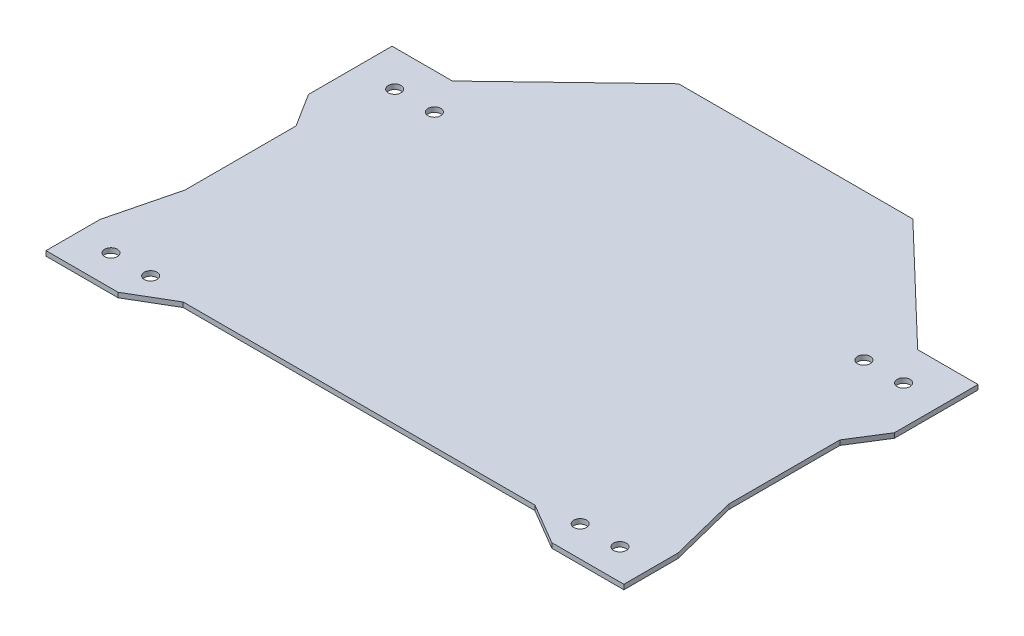
ISO-10303-21;
HEADER;
FILE_DESCRIPTION(('STEP AP214'),'2;1');
FILE_NAME('part.step','',(''),(''),'','','');
FILE_SCHEMA(('AUTOMOTIVE_DESIGN { 1 0 10303 214 1 1 1 1 }'));
ENDSEC;
DATA;
#1=APPLICATION_CONTEXT('core data for automotive mechanical design processes');
#2=APPLICATION_PROTOCOL_DEFINITION('international standard','automotive_design',2000,#1);
#3=PRODUCT_CONTEXT('',#1,'mechanical');
#4=PRODUCT('Part','Part','',(#3));
#5=PRODUCT_RELATED_PRODUCT_CATEGORY('part','',(#4));
#6=PRODUCT_DEFINITION_FORMATION('','',#4);
#7=PRODUCT_DEFINITION_CONTEXT('part definition',#1,'design');
#8=PRODUCT_DEFINITION('design','',#6,#7);
#9=PRODUCT_DEFINITION_SHAPE('','',#8);
#10=(LENGTH_UNIT() NAMED_UNIT(*) SI_UNIT(.MILLI.,.METRE.));
#11=(NAMED_UNIT(*) PLANE_ANGLE_UNIT() SI_UNIT($,.RADIAN.));
#12=(NAMED_UNIT(*) SI_UNIT($,.STERADIAN.) SOLID_ANGLE_UNIT());
#13=UNCERTAINTY_MEASURE_WITH_UNIT(LENGTH_MEASURE(1.E-05),#10,'distance_accuracy_value','');
#14=(GEOMETRIC_REPRESENTATION_CONTEXT(3) GLOBAL_UNCERTAINTY_ASSIGNED_CONTEXT((#13)) GLOBAL_UNIT_ASSIGNED_CONTEXT((#10,
#11,#12)) REPRESENTATION_CONTEXT('',''));
#15=CARTESIAN_POINT('',(0.,0.,0.));
#16=DIRECTION('',(0.,0.,1.));
#17=DIRECTION('',(1.,0.,0.));
#18=AXIS2_PLACEMENT_3D('',#15,#16,#17);
#19=CARTESIAN_POINT('',(0.,1.7,0.));
#20=DIRECTION('',(0.,1.,0.));
#21=DIRECTION('',(0.,0.,1.));
#22=AXIS2_PLACEMENT_3D('',#19,#20,#21);
#23=PLANE('',#22);
#24=CARTESIAN_POINT('',(75.69375,1.7,-132.844175958542));
#25=DIRECTION('',(0.,1.,0.));
#26=DIRECTION('',(0.,0.,-1.));
#27=AXIS2_PLACEMENT_3D('',#24,#25,#26);
#28=CIRCLE('',#27,2.25);
#29=CARTESIAN_POINT('',(75.69375,1.7,-135.094175958542));
#30=VERTEX_POINT('',#29);
#31=EDGE_CURVE('E481',#30,#30,#28,.T.);
#32=ORIENTED_EDGE('',*,*,#31,.F.);
#33=EDGE_LOOP('',(#32));
#34=FACE_BOUND('',#33,.T.);
#35=CARTESIAN_POINT('',(75.69375,1.7,-32.8489759585417));
#36=DIRECTION('',(0.,1.,0.));
#37=DIRECTION('',(0.,0.,-1.));
#38=AXIS2_PLACEMENT_3D('',#35,#36,#37);
#39=CIRCLE('',#38,2.25);
#40=CARTESIAN_POINT('',(75.69375,1.7,-35.0989759585417));
#41=VERTEX_POINT('',#40);
#42=EDGE_CURVE('E497',#41,#41,#39,.T.);
#43=ORIENTED_EDGE('',*,*,#42,.F.);
#44=EDGE_LOOP('',(#43));
#45=FACE_BOUND('',#44,.T.);
#46=CARTESIAN_POINT('',(-89.69375,1.7,-132.844175958542));
#47=DIRECTION('',(0.,1.,0.));
#48=DIRECTION('',(0.,0.,1.));
#49=AXIS2_PLACEMENT_3D('',#46,#47,#48);
#50=CIRCLE('',#49,2.25);
#51=CARTESIAN_POINT('',(-89.69375,1.7,-130.594175958542));
#52=VERTEX_POINT('',#51);
#53=EDGE_CURVE('E513',#52,#52,#50,.T.);
#54=ORIENTED_EDGE('',*,*,#53,.F.);
#55=EDGE_LOOP('',(#54));
#56=FACE_BOUND('',#55,.T.);
#57=CARTESIAN_POINT('',(-89.69375,1.7,-32.8489759585416));
#58=DIRECTION('',(0.,1.,0.));
#59=DIRECTION('',(0.,0.,1.));
#60=AXIS2_PLACEMENT_3D('',#57,#58,#59);
#61=CIRCLE('',#60,2.25);
#62=CARTESIAN_POINT('',(-89.69375,1.7,-30.5989759585416));
#63=VERTEX_POINT('',#62);
#64=EDGE_CURVE('E223',#63,#63,#61,.T.);
#65=ORIENTED_EDGE('',*,*,#64,.F.);
#66=EDGE_LOOP('',(#65));
#67=FACE_BOUND('',#66,.T.);
#68=DIRECTION('',(-0.721982227225083,0.,0.69191160098029));
#69=VECTOR('',#68,1.);
#70=CARTESIAN_POINT('',(-41.275,1.7,-184.522975958542));
#71=LINE('',#70,#69);
#72=CARTESIAN_POINT('',(-41.275,1.7,-184.522975958542));
#73=VERTEX_POINT('',#72);
#74=CARTESIAN_POINT('',(-82.,1.7,-145.494175958542));
#75=VERTEX_POINT('',#74);
#76=EDGE_CURVE('E277',#73,#75,#71,.T.);
#77=ORIENTED_EDGE('',*,*,#76,.T.);
#78=DIRECTION('',(-1.,0.,0.));
#79=VECTOR('',#78,1.);
#80=CARTESIAN_POINT('',(-82.,1.7,-145.494175958542));
#81=LINE('',#80,#79);
#82=CARTESIAN_POINT('',(-103.26875,1.7,-145.494175958542));
#83=VERTEX_POINT('',#82);
#84=EDGE_CURVE('E141',#75,#83,#81,.T.);
#85=ORIENTED_EDGE('',*,*,#84,.T.);
#86=DIRECTION('',(0.,0.,1.));
#87=VECTOR('',#86,1.);
#88=CARTESIAN_POINT('',(-103.26875,1.7,-145.494175958542));
#89=LINE('',#88,#87);
#90=CARTESIAN_POINT('',(-103.26875,1.7,-116.051129388527));
#91=VERTEX_POINT('',#90);
#92=EDGE_CURVE('E346',#83,#91,#89,.T.);
#93=ORIENTED_EDGE('',*,*,#92,.T.);
#94=DIRECTION('',(0.531543936879277,0.,0.847030721501221));
#95=VECTOR('',#94,1.);
#96=CARTESIAN_POINT('',(-103.26875,1.7,-116.051129388527));
#97=LINE('',#96,#95);
#98=CARTESIAN_POINT('',(-95.8437500000001,1.7,-104.219175958542));
#99=VERTEX_POINT('',#98);
#100=EDGE_CURVE('E366',#91,#99,#97,.T.);
#101=ORIENTED_EDGE('',*,*,#100,.T.);
#102=DIRECTION('',(0.,0.,1.));
#103=VECTOR('',#102,1.);
#104=CARTESIAN_POINT('',(-95.8437500000001,1.7,-104.219175958542));
#105=LINE('',#104,#103);
#106=CARTESIAN_POINT('',(-95.8437500000001,1.7,-65.0989759585416));
#107=VERTEX_POINT('',#106);
#108=EDGE_CURVE('E362',#99,#107,#105,.T.);
#109=ORIENTED_EDGE('',*,*,#108,.T.);
#110=DIRECTION('',(-0.24296627076329,0.,0.970034737146758));
#111=VECTOR('',#110,1.);
#112=CARTESIAN_POINT('',(-95.8437500000001,1.7,-65.0989759585416));
#113=LINE('',#112,#111);
#114=CARTESIAN_POINT('',(-101.84375,1.7,-41.1441759585416));
#115=VERTEX_POINT('',#114);
#116=EDGE_CURVE('E365',#107,#115,#113,.T.);
#117=ORIENTED_EDGE('',*,*,#116,.T.);
#118=DIRECTION('',(0.,0.,1.));
#119=VECTOR('',#118,1.);
#120=CARTESIAN_POINT('',(-101.84375,1.7,-41.1441759585416));
#121=LINE('',#120,#119);
#122=CARTESIAN_POINT('',(-101.84375,1.7,-22.0941759585416));
#123=VERTEX_POINT('',#122);
#124=EDGE_CURVE('E370',#115,#123,#121,.T.);
#125=ORIENTED_EDGE('',*,*,#124,.T.);
#126=DIRECTION('',(1.,0.,0.));
#127=VECTOR('',#126,1.);
#128=CARTESIAN_POINT('',(-101.84375,1.7,-22.0941759585416));
#129=LINE('',#128,#127);
#130=CARTESIAN_POINT('',(-76.44375,1.7,-22.0941759585416));
#131=VERTEX_POINT('',#130);
#132=EDGE_CURVE('E377',#123,#131,#129,.T.);
#133=ORIENTED_EDGE('',*,*,#132,.T.);
#134=DIRECTION('',(0.861809081293842,0.,-0.507232794089129));
#135=VECTOR('',#134,1.);
#136=CARTESIAN_POINT('',(-76.44375,1.7,-22.0941759585416));
#137=LINE('',#136,#135);
#138=CARTESIAN_POINT('',(-61.9937500000001,1.7,-30.5989759585416));
#139=VERTEX_POINT('',#138);
#140=EDGE_CURVE('E380',#131,#139,#137,.T.);
#141=ORIENTED_EDGE('',*,*,#140,.T.);
#142=DIRECTION('',(1.,0.,0.));
#143=VECTOR('',#142,1.);
#144=CARTESIAN_POINT('',(-61.9937500000001,1.7,-30.5989759585416));
#145=LINE('',#144,#143);
#146=CARTESIAN_POINT('',(61.9937500000001,1.7,-30.5989759585416));
#147=VERTEX_POINT('',#146);
#148=EDGE_CURVE('E383',#139,#147,#145,.T.);
#149=ORIENTED_EDGE('',*,*,#148,.T.);
#150=DIRECTION('',(0.861809081293842,0.,0.507232794089129));
#151=VECTOR('',#150,1.);
#152=CARTESIAN_POINT('',(76.44375,1.7,-22.0941759585416));
#153=LINE('',#152,#151);
#154=CARTESIAN_POINT('',(76.44375,1.7,-22.0941759585416));
#155=VERTEX_POINT('',#154);
#156=EDGE_CURVE('E386',#147,#155,#153,.T.);
#157=ORIENTED_EDGE('',*,*,#156,.T.);
#158=DIRECTION('',(1.,0.,0.));
#159=VECTOR('',#158,1.);
#160=CARTESIAN_POINT('',(101.84375,1.7,-22.0941759585416));
#161=LINE('',#160,#159);
#162=CARTESIAN_POINT('',(101.84375,1.7,-22.0941759585416));
#163=VERTEX_POINT('',#162);
#164=EDGE_CURVE('E389',#155,#163,#161,.T.);
#165=ORIENTED_EDGE('',*,*,#164,.T.);
#166=DIRECTION('',(0.,0.,-1.));
#167=VECTOR('',#166,1.);
#168=CARTESIAN_POINT('',(101.84375,1.7,-41.1441759585417));
#169=LINE('',#168,#167);
#170=CARTESIAN_POINT('',(101.84375,1.7,-41.1441759585417));
#171=VERTEX_POINT('',#170);
#172=EDGE_CURVE('E392',#163,#171,#169,.T.);
#173=ORIENTED_EDGE('',*,*,#172,.T.);
#174=DIRECTION('',(-0.24296627076329,0.,-0.970034737146758));
#175=VECTOR('',#174,1.);
#176=CARTESIAN_POINT('',(95.8437500000001,1.7,-65.0989759585417));
#177=LINE('',#176,#175);
#178=CARTESIAN_POINT('',(95.8437500000001,1.7,-65.0989759585417));
#179=VERTEX_POINT('',#178);
#180=EDGE_CURVE('E395',#171,#179,#177,.T.);
#181=ORIENTED_EDGE('',*,*,#180,.T.);
#182=DIRECTION('',(0.,0.,-1.));
#183=VECTOR('',#182,1.);
#184=CARTESIAN_POINT('',(95.8437500000001,1.7,-104.219175958542));
#185=LINE('',#184,#183);
#186=CARTESIAN_POINT('',(95.8437500000001,1.7,-104.219175958542));
#187=VERTEX_POINT('',#186);
#188=EDGE_CURVE('E398',#179,#187,#185,.T.);
#189=ORIENTED_EDGE('',*,*,#188,.T.);
#190=DIRECTION('',(0.531543936879277,0.,-0.847030721501221));
#191=VECTOR('',#190,1.);
#192=CARTESIAN_POINT('',(103.26875,1.7,-116.051129388527));
#193=LINE('',#192,#191);
#194=CARTESIAN_POINT('',(103.26875,1.7,-116.051129388527));
#195=VERTEX_POINT('',#194);
#196=EDGE_CURVE('E401',#187,#195,#193,.T.);
#197=ORIENTED_EDGE('',*,*,#196,.T.);
#198=DIRECTION('',(0.,0.,-1.));
#199=VECTOR('',#198,1.);
#200=CARTESIAN_POINT('',(103.26875,1.7,-145.494175958542));
#201=LINE('',#200,#199);
#202=CARTESIAN_POINT('',(103.26875,1.7,-145.494175958542));
#203=VERTEX_POINT('',#202);
#204=EDGE_CURVE('E196',#195,#203,#201,.T.);
#205=ORIENTED_EDGE('',*,*,#204,.T.);
#206=DIRECTION('',(-1.,0.,0.));
#207=VECTOR('',#206,1.);
#208=CARTESIAN_POINT('',(82.,1.7,-145.494175958542));
#209=LINE('',#208,#207);
#210=CARTESIAN_POINT('',(82.,1.7,-145.494175958542));
#211=VERTEX_POINT('',#210);
#212=EDGE_CURVE('E190',#203,#211,#209,.T.);
#213=ORIENTED_EDGE('',*,*,#212,.T.);
#214=DIRECTION('',(-0.721982227225084,0.,-0.69191160098029));
#215=VECTOR('',#214,1.);
#216=CARTESIAN_POINT('',(41.275,1.7,-184.522975958542));
#217=LINE('',#216,#215);
#218=CARTESIAN_POINT('',(41.275,1.7,-184.522975958542));
#219=VERTEX_POINT('',#218);
#220=EDGE_CURVE('E194',#211,#219,#217,.T.);
#221=ORIENTED_EDGE('',*,*,#220,.T.);
#222=DIRECTION('',(-1.,0.,0.));
#223=VECTOR('',#222,1.);
#224=CARTESIAN_POINT('',(41.275,1.7,-184.522975958542));
#225=LINE('',#224,#223);
#226=EDGE_CURVE('E62',#219,#73,#225,.T.);
#227=ORIENTED_EDGE('',*,*,#226,.T.);
#228=EDGE_LOOP('',(#77,#85,#93,#101,#109,#117,#125,#133,#141,#149,#157,#165,#173,#181,#189,#197,
#205,#213,#221,#227));
#229=FACE_BOUND('',#228,.T.);
#230=CARTESIAN_POINT('',(-75.69375,1.7,-32.8489759585416));
#231=DIRECTION('',(0.,1.,0.));
#232=DIRECTION('',(0.,0.,1.));
#233=AXIS2_PLACEMENT_3D('',#230,#231,#232);
#234=CIRCLE('',#233,2.25);
#235=CARTESIAN_POINT('',(-75.69375,1.7,-30.5989759585416));
#236=VERTEX_POINT('',#235);
#237=EDGE_CURVE('E521',#236,#236,#234,.T.);
#238=ORIENTED_EDGE('',*,*,#237,.F.);
#239=EDGE_LOOP('',(#238));
#240=FACE_BOUND('',#239,.T.);
#241=CARTESIAN_POINT('',(-75.69375,1.7,-132.844175958542));
#242=DIRECTION('',(0.,1.,0.));
#243=DIRECTION('',(0.,0.,1.));
#244=AXIS2_PLACEMENT_3D('',#241,#242,#243);
#245=CIRCLE('',#244,2.25);
#246=CARTESIAN_POINT('',(-75.69375,1.7,-130.594175958542));
#247=VERTEX_POINT('',#246);
#248=EDGE_CURVE('E505',#247,#247,#245,.T.);
#249=ORIENTED_EDGE('',*,*,#248,.F.);
#250=EDGE_LOOP('',(#249));
#251=FACE_BOUND('',#250,.T.);
#252=CARTESIAN_POINT('',(89.69375,1.7,-32.8489759585416));
#253=DIRECTION('',(0.,1.,0.));
#254=DIRECTION('',(0.,0.,-1.));
#255=AXIS2_PLACEMENT_3D('',#252,#253,#254);
#256=CIRCLE('',#255,2.25);
#257=CARTESIAN_POINT('',(89.69375,1.7,-35.0989759585416));
#258=VERTEX_POINT('',#257);
#259=EDGE_CURVE('E489',#258,#258,#256,.T.);
#260=ORIENTED_EDGE('',*,*,#259,.F.);
#261=EDGE_LOOP('',(#260));
#262=FACE_BOUND('',#261,.T.);
#263=CARTESIAN_POINT('',(89.69375,1.7,-132.844175958542));
#264=DIRECTION('',(0.,1.,0.));
#265=DIRECTION('',(0.,0.,-1.));
#266=AXIS2_PLACEMENT_3D('',#263,#264,#265);
#267=CIRCLE('',#266,2.25);
#268=CARTESIAN_POINT('',(89.69375,1.7,-135.094175958542));
#269=VERTEX_POINT('',#268);
#270=EDGE_CURVE('E470',#269,#269,#267,.T.);
#271=ORIENTED_EDGE('',*,*,#270,.F.);
#272=EDGE_LOOP('',(#271));
#273=FACE_BOUND('',#272,.T.);
#274=ADVANCED_FACE('F44',(#34,#45,#56,#67,#229,#240,#251,#262,#273),#23,.T.);
#275=CARTESIAN_POINT('',(0.,0.,0.));
#276=DIRECTION('',(0.,1.,0.));
#277=DIRECTION('',(0.,0.,1.));
#278=AXIS2_PLACEMENT_3D('',#275,#276,#277);
#279=PLANE('',#278);
#280=DIRECTION('',(-0.721982227225083,0.,0.69191160098029));
#281=VECTOR('',#280,1.);
#282=CARTESIAN_POINT('',(-41.275,0.,-184.522975958542));
#283=LINE('',#282,#281);
#284=CARTESIAN_POINT('',(-41.275,0.,-184.522975958542));
#285=VERTEX_POINT('',#284);
#286=CARTESIAN_POINT('',(-82.,0.,-145.494175958542));
#287=VERTEX_POINT('',#286);
#288=EDGE_CURVE('E218',#285,#287,#283,.T.);
#289=ORIENTED_EDGE('',*,*,#288,.F.);
#290=DIRECTION('',(-1.,0.,0.));
#291=VECTOR('',#290,1.);
#292=CARTESIAN_POINT('',(41.275,0.,-184.522975958542));
#293=LINE('',#292,#291);
#294=CARTESIAN_POINT('',(41.275,0.,-184.522975958542));
#295=VERTEX_POINT('',#294);
#296=EDGE_CURVE('E133',#295,#285,#293,.T.);
#297=ORIENTED_EDGE('',*,*,#296,.F.);
#298=DIRECTION('',(-0.721982227225084,0.,-0.69191160098029));
#299=VECTOR('',#298,1.);
#300=CARTESIAN_POINT('',(41.275,0.,-184.522975958542));
#301=LINE('',#300,#299);
#302=CARTESIAN_POINT('',(82.,0.,-145.494175958542));
#303=VERTEX_POINT('',#302);
#304=EDGE_CURVE('E127',#303,#295,#301,.T.);
#305=ORIENTED_EDGE('',*,*,#304,.F.);
#306=DIRECTION('',(-1.,0.,0.));
#307=VECTOR('',#306,1.);
#308=CARTESIAN_POINT('',(82.,0.,-145.494175958542));
#309=LINE('',#308,#307);
#310=CARTESIAN_POINT('',(103.26875,0.,-145.494175958542));
#311=VERTEX_POINT('',#310);
#312=EDGE_CURVE('E205',#311,#303,#309,.T.);
#313=ORIENTED_EDGE('',*,*,#312,.F.);
#314=DIRECTION('',(0.,0.,-1.));
#315=VECTOR('',#314,1.);
#316=CARTESIAN_POINT('',(103.26875,0.,-145.494175958542));
#317=LINE('',#316,#315);
#318=CARTESIAN_POINT('',(103.26875,0.,-116.051129388527));
#319=VERTEX_POINT('',#318);
#320=EDGE_CURVE('E268',#319,#311,#317,.T.);
#321=ORIENTED_EDGE('',*,*,#320,.F.);
#322=DIRECTION('',(0.531543936879277,0.,-0.847030721501221));
#323=VECTOR('',#322,1.);
#324=CARTESIAN_POINT('',(103.26875,0.,-116.051129388527));
#325=LINE('',#324,#323);
#326=CARTESIAN_POINT('',(95.8437500000001,0.,-104.219175958542));
#327=VERTEX_POINT('',#326);
#328=EDGE_CURVE('E265',#327,#319,#325,.T.);
#329=ORIENTED_EDGE('',*,*,#328,.F.);
#330=DIRECTION('',(0.,0.,-1.));
#331=VECTOR('',#330,1.);
#332=CARTESIAN_POINT('',(95.8437500000001,0.,-104.219175958542));
#333=LINE('',#332,#331);
#334=CARTESIAN_POINT('',(95.8437500000001,0.,-65.0989759585417));
#335=VERTEX_POINT('',#334);
#336=EDGE_CURVE('E262',#335,#327,#333,.T.);
#337=ORIENTED_EDGE('',*,*,#336,.F.);
#338=DIRECTION('',(-0.24296627076329,0.,-0.970034737146758));
#339=VECTOR('',#338,1.);
#340=CARTESIAN_POINT('',(95.8437500000001,0.,-65.0989759585417));
#341=LINE('',#340,#339);
#342=CARTESIAN_POINT('',(101.84375,0.,-41.1441759585417));
#343=VERTEX_POINT('',#342);
#344=EDGE_CURVE('E259',#343,#335,#341,.T.);
#345=ORIENTED_EDGE('',*,*,#344,.F.);
#346=DIRECTION('',(0.,0.,-1.));
#347=VECTOR('',#346,1.);
#348=CARTESIAN_POINT('',(101.84375,0.,-41.1441759585417));
#349=LINE('',#348,#347);
#350=CARTESIAN_POINT('',(101.84375,0.,-22.0941759585416));
#351=VERTEX_POINT('',#350);
#352=EDGE_CURVE('E256',#351,#343,#349,.T.);
#353=ORIENTED_EDGE('',*,*,#352,.F.);
#354=DIRECTION('',(1.,0.,0.));
#355=VECTOR('',#354,1.);
#356=CARTESIAN_POINT('',(101.84375,0.,-22.0941759585416));
#357=LINE('',#356,#355);
#358=CARTESIAN_POINT('',(76.44375,0.,-22.0941759585416));
#359=VERTEX_POINT('',#358);
#360=EDGE_CURVE('E253',#359,#351,#357,.T.);
#361=ORIENTED_EDGE('',*,*,#360,.F.);
#362=DIRECTION('',(0.861809081293842,0.,0.507232794089129));
#363=VECTOR('',#362,1.);
#364=CARTESIAN_POINT('',(76.44375,0.,-22.0941759585416));
#365=LINE('',#364,#363);
#366=CARTESIAN_POINT('',(61.9937500000001,0.,-30.5989759585416));
#367=VERTEX_POINT('',#366);
#368=EDGE_CURVE('E250',#367,#359,#365,.T.);
#369=ORIENTED_EDGE('',*,*,#368,.F.);
#370=DIRECTION('',(1.,0.,0.));
#371=VECTOR('',#370,1.);
#372=CARTESIAN_POINT('',(-61.9937500000001,0.,-30.5989759585416));
#373=LINE('',#372,#371);
#374=CARTESIAN_POINT('',(-61.9937500000001,0.,-30.5989759585416));
#375=VERTEX_POINT('',#374);
#376=EDGE_CURVE('E247',#375,#367,#373,.T.);
#377=ORIENTED_EDGE('',*,*,#376,.F.);
#378=DIRECTION('',(0.861809081293842,0.,-0.507232794089129));
#379=VECTOR('',#378,1.);
#380=CARTESIAN_POINT('',(-76.44375,0.,-22.0941759585416));
#381=LINE('',#380,#379);
#382=CARTESIAN_POINT('',(-76.44375,0.,-22.0941759585416));
#383=VERTEX_POINT('',#382);
#384=EDGE_CURVE('E244',#383,#375,#381,.T.);
#385=ORIENTED_EDGE('',*,*,#384,.F.);
#386=DIRECTION('',(1.,0.,0.));
#387=VECTOR('',#386,1.);
#388=CARTESIAN_POINT('',(-101.84375,0.,-22.0941759585416));
#389=LINE('',#388,#387);
#390=CARTESIAN_POINT('',(-101.84375,0.,-22.0941759585416));
#391=VERTEX_POINT('',#390);
#392=EDGE_CURVE('E241',#391,#383,#389,.T.);
#393=ORIENTED_EDGE('',*,*,#392,.F.);
#394=DIRECTION('',(0.,0.,1.));
#395=VECTOR('',#394,1.);
#396=CARTESIAN_POINT('',(-101.84375,0.,-41.1441759585416));
#397=LINE('',#396,#395);
#398=CARTESIAN_POINT('',(-101.84375,0.,-41.1441759585416));
#399=VERTEX_POINT('',#398);
#400=EDGE_CURVE('E238',#399,#391,#397,.T.);
#401=ORIENTED_EDGE('',*,*,#400,.F.);
#402=DIRECTION('',(-0.24296627076329,0.,0.970034737146758));
#403=VECTOR('',#402,1.);
#404=CARTESIAN_POINT('',(-95.8437500000001,0.,-65.0989759585416));
#405=LINE('',#404,#403);
#406=CARTESIAN_POINT('',(-95.8437500000001,0.,-65.0989759585416));
#407=VERTEX_POINT('',#406);
#408=EDGE_CURVE('E235',#407,#399,#405,.T.);
#409=ORIENTED_EDGE('',*,*,#408,.F.);
#410=DIRECTION('',(0.,0.,1.));
#411=VECTOR('',#410,1.);
#412=CARTESIAN_POINT('',(-95.8437500000001,0.,-104.219175958542));
#413=LINE('',#412,#411);
#414=CARTESIAN_POINT('',(-95.8437500000001,0.,-104.219175958542));
#415=VERTEX_POINT('',#414);
#416=EDGE_CURVE('E232',#415,#407,#413,.T.);
#417=ORIENTED_EDGE('',*,*,#416,.F.);
#418=DIRECTION('',(0.531543936879277,0.,0.847030721501221));
#419=VECTOR('',#418,1.);
#420=CARTESIAN_POINT('',(-103.26875,0.,-116.051129388527));
#421=LINE('',#420,#419);
#422=CARTESIAN_POINT('',(-103.26875,0.,-116.051129388527));
#423=VERTEX_POINT('',#422);
#424=EDGE_CURVE('E229',#423,#415,#421,.T.);
#425=ORIENTED_EDGE('',*,*,#424,.F.);
#426=DIRECTION('',(0.,0.,1.));
#427=VECTOR('',#426,1.);
#428=CARTESIAN_POINT('',(-103.26875,0.,-145.494175958542));
#429=LINE('',#428,#427);
#430=CARTESIAN_POINT('',(-103.26875,0.,-145.494175958542));
#431=VERTEX_POINT('',#430);
#432=EDGE_CURVE('E226',#431,#423,#429,.T.);
#433=ORIENTED_EDGE('',*,*,#432,.F.);
#434=DIRECTION('',(-1.,0.,0.));
#435=VECTOR('',#434,1.);
#436=CARTESIAN_POINT('',(-82.,0.,-145.494175958542));
#437=LINE('',#436,#435);
#438=EDGE_CURVE('E222',#287,#431,#437,.T.);
#439=ORIENTED_EDGE('',*,*,#438,.F.);
#440=EDGE_LOOP('',(#289,#297,#305,#313,#321,#329,#337,#345,#353,#361,#369,#377,#385,#393,#401,
#409,#417,#425,#433,#439));
#441=FACE_BOUND('',#440,.T.);
#442=CARTESIAN_POINT('',(-89.69375,0.,-32.8489759585416));
#443=DIRECTION('',(0.,1.,0.));
#444=DIRECTION('',(0.,0.,1.));
#445=AXIS2_PLACEMENT_3D('',#442,#443,#444);
#446=CIRCLE('',#445,2.25);
#447=CARTESIAN_POINT('',(-89.69375,0.,-30.5989759585416));
#448=VERTEX_POINT('',#447);
#449=EDGE_CURVE('E525',#448,#448,#446,.T.);
#450=ORIENTED_EDGE('',*,*,#449,.T.);
#451=EDGE_LOOP('',(#450));
#452=FACE_BOUND('',#451,.T.);
#453=CARTESIAN_POINT('',(-75.69375,0.,-32.8489759585416));
#454=DIRECTION('',(0.,1.,0.));
#455=DIRECTION('',(0.,0.,1.));
#456=AXIS2_PLACEMENT_3D('',#453,#454,#455);
#457=CIRCLE('',#456,2.25);
#458=CARTESIAN_POINT('',(-75.69375,0.,-30.5989759585416));
#459=VERTEX_POINT('',#458);
#460=EDGE_CURVE('E517',#459,#459,#457,.T.);
#461=ORIENTED_EDGE('',*,*,#460,.T.);
#462=EDGE_LOOP('',(#461));
#463=FACE_BOUND('',#462,.T.);
#464=CARTESIAN_POINT('',(-89.69375,0.,-132.844175958542));
#465=DIRECTION('',(0.,1.,0.));
#466=DIRECTION('',(0.,0.,1.));
#467=AXIS2_PLACEMENT_3D('',#464,#465,#466);
#468=CIRCLE('',#467,2.25);
#469=CARTESIAN_POINT('',(-89.69375,0.,-130.594175958542));
#470=VERTEX_POINT('',#469);
#471=EDGE_CURVE('E509',#470,#470,#468,.T.);
#472=ORIENTED_EDGE('',*,*,#471,.T.);
#473=EDGE_LOOP('',(#472));
#474=FACE_BOUND('',#473,.T.);
#475=CARTESIAN_POINT('',(-75.69375,0.,-132.844175958542));
#476=DIRECTION('',(0.,1.,0.));
#477=DIRECTION('',(0.,0.,1.));
#478=AXIS2_PLACEMENT_3D('',#475,#476,#477);
#479=CIRCLE('',#478,2.25);
#480=CARTESIAN_POINT('',(-75.69375,0.,-130.594175958542));
#481=VERTEX_POINT('',#480);
#482=EDGE_CURVE('E501',#481,#481,#479,.T.);
#483=ORIENTED_EDGE('',*,*,#482,.T.);
#484=EDGE_LOOP('',(#483));
#485=FACE_BOUND('',#484,.T.);
#486=CARTESIAN_POINT('',(75.69375,0.,-32.8489759585417));
#487=DIRECTION('',(0.,1.,0.));
#488=DIRECTION('',(0.,0.,-1.));
#489=AXIS2_PLACEMENT_3D('',#486,#487,#488);
#490=CIRCLE('',#489,2.25);
#491=CARTESIAN_POINT('',(75.69375,0.,-35.0989759585417));
#492=VERTEX_POINT('',#491);
#493=EDGE_CURVE('E493',#492,#492,#490,.T.);
#494=ORIENTED_EDGE('',*,*,#493,.T.);
#495=EDGE_LOOP('',(#494));
#496=FACE_BOUND('',#495,.T.);
#497=CARTESIAN_POINT('',(89.69375,0.,-32.8489759585416));
#498=DIRECTION('',(0.,1.,0.));
#499=DIRECTION('',(0.,0.,-1.));
#500=AXIS2_PLACEMENT_3D('',#497,#498,#499);
#501=CIRCLE('',#500,2.25);
#502=CARTESIAN_POINT('',(89.69375,0.,-35.0989759585416));
#503=VERTEX_POINT('',#502);
#504=EDGE_CURVE('E485',#503,#503,#501,.T.);
#505=ORIENTED_EDGE('',*,*,#504,.T.);
#506=EDGE_LOOP('',(#505));
#507=FACE_BOUND('',#506,.T.);
#508=CARTESIAN_POINT('',(75.69375,0.,-132.844175958542));
#509=DIRECTION('',(0.,1.,0.));
#510=DIRECTION('',(0.,0.,-1.));
#511=AXIS2_PLACEMENT_3D('',#508,#509,#510);
#512=CIRCLE('',#511,2.25);
#513=CARTESIAN_POINT('',(75.69375,0.,-135.094175958542));
#514=VERTEX_POINT('',#513);
#515=EDGE_CURVE('E478',#514,#514,#512,.T.);
#516=ORIENTED_EDGE('',*,*,#515,.T.);
#517=EDGE_LOOP('',(#516));
#518=FACE_BOUND('',#517,.T.);
#519=CARTESIAN_POINT('',(89.69375,0.,-132.844175958542));
#520=DIRECTION('',(0.,1.,0.));
#521=DIRECTION('',(0.,0.,-1.));
#522=AXIS2_PLACEMENT_3D('',#519,#520,#521);
#523=CIRCLE('',#522,2.25);
#524=CARTESIAN_POINT('',(89.69375,0.,-135.094175958542));
#525=VERTEX_POINT('',#524);
#526=EDGE_CURVE('E473',#525,#525,#523,.T.);
#527=ORIENTED_EDGE('',*,*,#526,.T.);
#528=EDGE_LOOP('',(#527));
#529=FACE_BOUND('',#528,.T.);
#530=ADVANCED_FACE('F350',(#441,#452,#463,#474,#485,#496,#507,#518,#529),#279,.F.);
#531=CARTESIAN_POINT('',(-41.275,1.7,-184.522975958542));
#532=DIRECTION('',(0.69191160098029,0.,0.721982227225083));
#533=DIRECTION('',(0.721982227225083,0.,-0.69191160098029));
#534=AXIS2_PLACEMENT_3D('',#531,#532,#533);
#535=PLANE('',#534);
#536=ORIENTED_EDGE('',*,*,#288,.T.);
#537=DIRECTION('',(0.,-1.,0.));
#538=VECTOR('',#537,1.);
#539=CARTESIAN_POINT('',(-82.,1.7,-145.494175958542));
#540=LINE('',#539,#538);
#541=EDGE_CURVE('E11',#75,#287,#540,.T.);
#542=ORIENTED_EDGE('',*,*,#541,.F.);
#543=ORIENTED_EDGE('',*,*,#76,.F.);
#544=DIRECTION('',(0.,-1.,0.));
#545=VECTOR('',#544,1.);
#546=CARTESIAN_POINT('',(-41.275,1.7,-184.522975958542));
#547=LINE('',#546,#545);
#548=EDGE_CURVE('E214',#73,#285,#547,.T.);
#549=ORIENTED_EDGE('',*,*,#548,.T.);
#550=EDGE_LOOP('',(#536,#542,#543,#549));
#551=FACE_BOUND('',#550,.T.);
#552=ADVANCED_FACE('F46',(#551),#535,.F.);
#553=CARTESIAN_POINT('',(-82.,1.7,-145.494175958542));
#554=DIRECTION('',(0.,0.,1.));
#555=DIRECTION('',(1.,0.,0.));
#556=AXIS2_PLACEMENT_3D('',#553,#554,#555);
#557=PLANE('',#556);
#558=ORIENTED_EDGE('',*,*,#438,.T.);
#559=DIRECTION('',(0.,-1.,0.));
#560=VECTOR('',#559,1.);
#561=CARTESIAN_POINT('',(-103.26875,1.7,-145.494175958542));
#562=LINE('',#561,#560);
#563=EDGE_CURVE('E54',#83,#431,#562,.T.);
#564=ORIENTED_EDGE('',*,*,#563,.F.);
#565=ORIENTED_EDGE('',*,*,#84,.F.);
#566=ORIENTED_EDGE('',*,*,#541,.T.);
#567=EDGE_LOOP('',(#558,#564,#565,#566));
#568=FACE_BOUND('',#567,.T.);
#569=ADVANCED_FACE('F765',(#568),#557,.F.);
#570=CARTESIAN_POINT('',(-103.26875,1.7,-145.494175958542));
#571=DIRECTION('',(1.,0.,0.));
#572=DIRECTION('',(0.,0.,-1.));
#573=AXIS2_PLACEMENT_3D('',#570,#571,#572);
#574=PLANE('',#573);
#575=ORIENTED_EDGE('',*,*,#432,.T.);
#576=DIRECTION('',(0.,-1.,0.));
#577=VECTOR('',#576,1.);
#578=CARTESIAN_POINT('',(-103.26875,1.7,-116.051129388527));
#579=LINE('',#578,#577);
#580=EDGE_CURVE('E336',#91,#423,#579,.T.);
#581=ORIENTED_EDGE('',*,*,#580,.F.);
#582=ORIENTED_EDGE('',*,*,#92,.F.);
#583=ORIENTED_EDGE('',*,*,#563,.T.);
#584=EDGE_LOOP('',(#575,#581,#582,#583));
#585=FACE_BOUND('',#584,.T.);
#586=ADVANCED_FACE('F344',(#585),#574,.F.);
#587=CARTESIAN_POINT('',(-103.26875,1.7,-116.051129388527));
#588=DIRECTION('',(0.847030721501221,0.,-0.531543936879277));
#589=DIRECTION('',(-0.531543936879277,0.,-0.847030721501221));
#590=AXIS2_PLACEMENT_3D('',#587,#588,#589);
#591=PLANE('',#590);
#592=ORIENTED_EDGE('',*,*,#424,.T.);
#593=DIRECTION('',(0.,-1.,0.));
#594=VECTOR('',#593,1.);
#595=CARTESIAN_POINT('',(-95.8437500000001,1.7,-104.219175958542));
#596=LINE('',#595,#594);
#597=EDGE_CURVE('E332',#99,#415,#596,.T.);
#598=ORIENTED_EDGE('',*,*,#597,.F.);
#599=ORIENTED_EDGE('',*,*,#100,.F.);
#600=ORIENTED_EDGE('',*,*,#580,.T.);
#601=EDGE_LOOP('',(#592,#598,#599,#600));
#602=FACE_BOUND('',#601,.T.);
#603=ADVANCED_FACE('F356',(#602),#591,.F.);
#604=CARTESIAN_POINT('',(-95.8437500000001,1.7,-104.219175958542));
#605=DIRECTION('',(1.,0.,0.));
#606=DIRECTION('',(0.,0.,-1.));
#607=AXIS2_PLACEMENT_3D('',#604,#605,#606);
#608=PLANE('',#607);
#609=ORIENTED_EDGE('',*,*,#416,.T.);
#610=DIRECTION('',(0.,-1.,0.));
#611=VECTOR('',#610,1.);
#612=CARTESIAN_POINT('',(-95.8437500000001,1.7,-65.0989759585416));
#613=LINE('',#612,#611);
#614=EDGE_CURVE('E328',#107,#407,#613,.T.);
#615=ORIENTED_EDGE('',*,*,#614,.F.);
#616=ORIENTED_EDGE('',*,*,#108,.F.);
#617=ORIENTED_EDGE('',*,*,#597,.T.);
#618=EDGE_LOOP('',(#609,#615,#616,#617));
#619=FACE_BOUND('',#618,.T.);
#620=ADVANCED_FACE('F360',(#619),#608,.F.);
#621=CARTESIAN_POINT('',(-95.8437500000001,1.7,-65.0989759585416));
#622=DIRECTION('',(0.970034737146758,0.,0.24296627076329));
#623=DIRECTION('',(0.24296627076329,0.,-0.970034737146758));
#624=AXIS2_PLACEMENT_3D('',#621,#622,#623);
#625=PLANE('',#624);
#626=ORIENTED_EDGE('',*,*,#408,.T.);
#627=DIRECTION('',(0.,-1.,0.));
#628=VECTOR('',#627,1.);
#629=CARTESIAN_POINT('',(-101.84375,1.7,-41.1441759585416));
#630=LINE('',#629,#628);
#631=EDGE_CURVE('E324',#115,#399,#630,.T.);
#632=ORIENTED_EDGE('',*,*,#631,.F.);
#633=ORIENTED_EDGE('',*,*,#116,.F.);
#634=ORIENTED_EDGE('',*,*,#614,.T.);
#635=EDGE_LOOP('',(#626,#632,#633,#634));
#636=FACE_BOUND('',#635,.T.);
#637=ADVANCED_FACE('F730',(#636),#625,.F.);
#638=CARTESIAN_POINT('',(-101.84375,1.7,-41.1441759585416));
#639=DIRECTION('',(1.,0.,0.));
#640=DIRECTION('',(0.,0.,-1.));
#641=AXIS2_PLACEMENT_3D('',#638,#639,#640);
#642=PLANE('',#641);
#643=ORIENTED_EDGE('',*,*,#400,.T.);
#644=DIRECTION('',(0.,-1.,0.));
#645=VECTOR('',#644,1.);
#646=CARTESIAN_POINT('',(-101.84375,1.7,-22.0941759585416));
#647=LINE('',#646,#645);
#648=EDGE_CURVE('E320',#123,#391,#647,.T.);
#649=ORIENTED_EDGE('',*,*,#648,.F.);
#650=ORIENTED_EDGE('',*,*,#124,.F.);
#651=ORIENTED_EDGE('',*,*,#631,.T.);
#652=EDGE_LOOP('',(#643,#649,#650,#651));
#653=FACE_BOUND('',#652,.T.);
#654=ADVANCED_FACE('F720',(#653),#642,.F.);
#655=CARTESIAN_POINT('',(-101.84375,1.7,-22.0941759585416));
#656=DIRECTION('',(0.,0.,-1.));
#657=DIRECTION('',(-1.,0.,0.));
#658=AXIS2_PLACEMENT_3D('',#655,#656,#657);
#659=PLANE('',#658);
#660=ORIENTED_EDGE('',*,*,#392,.T.);
#661=DIRECTION('',(0.,-1.,0.));
#662=VECTOR('',#661,1.);
#663=CARTESIAN_POINT('',(-76.44375,1.7,-22.0941759585416));
#664=LINE('',#663,#662);
#665=EDGE_CURVE('E316',#131,#383,#664,.T.);
#666=ORIENTED_EDGE('',*,*,#665,.F.);
#667=ORIENTED_EDGE('',*,*,#132,.F.);
#668=ORIENTED_EDGE('',*,*,#648,.T.);
#669=EDGE_LOOP('',(#660,#666,#667,#668));
#670=FACE_BOUND('',#669,.T.);
#671=ADVANCED_FACE('F710',(#670),#659,.F.);
#672=CARTESIAN_POINT('',(-76.44375,1.7,-22.0941759585416));
#673=DIRECTION('',(-0.507232794089129,0.,-0.861809081293842));
#674=DIRECTION('',(-0.861809081293842,0.,0.507232794089129));
#675=AXIS2_PLACEMENT_3D('',#672,#673,#674);
#676=PLANE('',#675);
#677=ORIENTED_EDGE('',*,*,#384,.T.);
#678=DIRECTION('',(0.,-1.,0.));
#679=VECTOR('',#678,1.);
#680=CARTESIAN_POINT('',(-61.9937500000001,1.7,-30.5989759585416));
#681=LINE('',#680,#679);
#682=EDGE_CURVE('E312',#139,#375,#681,.T.);
#683=ORIENTED_EDGE('',*,*,#682,.F.);
#684=ORIENTED_EDGE('',*,*,#140,.F.);
#685=ORIENTED_EDGE('',*,*,#665,.T.);
#686=EDGE_LOOP('',(#677,#683,#684,#685));
#687=FACE_BOUND('',#686,.T.);
#688=ADVANCED_FACE('F700',(#687),#676,.F.);
#689=CARTESIAN_POINT('',(-61.9937500000001,1.7,-30.5989759585416));
#690=DIRECTION('',(0.,0.,-1.));
#691=DIRECTION('',(-1.,0.,0.));
#692=AXIS2_PLACEMENT_3D('',#689,#690,#691);
#693=PLANE('',#692);
#694=ORIENTED_EDGE('',*,*,#376,.T.);
#695=DIRECTION('',(0.,-1.,0.));
#696=VECTOR('',#695,1.);
#697=CARTESIAN_POINT('',(61.9937500000001,1.7,-30.5989759585416));
#698=LINE('',#697,#696);
#699=EDGE_CURVE('E308',#147,#367,#698,.T.);
#700=ORIENTED_EDGE('',*,*,#699,.F.);
#701=ORIENTED_EDGE('',*,*,#148,.F.);
#702=ORIENTED_EDGE('',*,*,#682,.T.);
#703=EDGE_LOOP('',(#694,#700,#701,#702));
#704=FACE_BOUND('',#703,.T.);
#705=ADVANCED_FACE('F690',(#704),#693,.F.);
#706=CARTESIAN_POINT('',(76.44375,1.7,-22.0941759585416));
#707=DIRECTION('',(0.507232794089129,0.,-0.861809081293842));
#708=DIRECTION('',(-0.861809081293842,0.,-0.507232794089129));
#709=AXIS2_PLACEMENT_3D('',#706,#707,#708);
#710=PLANE('',#709);
#711=ORIENTED_EDGE('',*,*,#368,.T.);
#712=DIRECTION('',(0.,-1.,0.));
#713=VECTOR('',#712,1.);
#714=CARTESIAN_POINT('',(76.44375,1.7,-22.0941759585416));
#715=LINE('',#714,#713);
#716=EDGE_CURVE('E304',#155,#359,#715,.T.);
#717=ORIENTED_EDGE('',*,*,#716,.F.);
#718=ORIENTED_EDGE('',*,*,#156,.F.);
#719=ORIENTED_EDGE('',*,*,#699,.T.);
#720=EDGE_LOOP('',(#711,#717,#718,#719));
#721=FACE_BOUND('',#720,.T.);
#722=ADVANCED_FACE('F680',(#721),#710,.F.);
#723=CARTESIAN_POINT('',(101.84375,1.7,-22.0941759585416));
#724=DIRECTION('',(0.,0.,-1.));
#725=DIRECTION('',(-1.,0.,0.));
#726=AXIS2_PLACEMENT_3D('',#723,#724,#725);
#727=PLANE('',#726);
#728=ORIENTED_EDGE('',*,*,#360,.T.);
#729=DIRECTION('',(0.,-1.,0.));
#730=VECTOR('',#729,1.);
#731=CARTESIAN_POINT('',(101.84375,1.7,-22.0941759585416));
#732=LINE('',#731,#730);
#733=EDGE_CURVE('E300',#163,#351,#732,.T.);
#734=ORIENTED_EDGE('',*,*,#733,.F.);
#735=ORIENTED_EDGE('',*,*,#164,.F.);
#736=ORIENTED_EDGE('',*,*,#716,.T.);
#737=EDGE_LOOP('',(#728,#734,#735,#736));
#738=FACE_BOUND('',#737,.T.);
#739=ADVANCED_FACE('F670',(#738),#727,.F.);
#740=CARTESIAN_POINT('',(101.84375,1.7,-41.1441759585417));
#741=DIRECTION('',(-1.,0.,0.));
#742=DIRECTION('',(0.,0.,1.));
#743=AXIS2_PLACEMENT_3D('',#740,#741,#742);
#744=PLANE('',#743);
#745=ORIENTED_EDGE('',*,*,#352,.T.);
#746=DIRECTION('',(0.,-1.,0.));
#747=VECTOR('',#746,1.);
#748=CARTESIAN_POINT('',(101.84375,1.7,-41.1441759585417));
#749=LINE('',#748,#747);
#750=EDGE_CURVE('E296',#171,#343,#749,.T.);
#751=ORIENTED_EDGE('',*,*,#750,.F.);
#752=ORIENTED_EDGE('',*,*,#172,.F.);
#753=ORIENTED_EDGE('',*,*,#733,.T.);
#754=EDGE_LOOP('',(#745,#751,#752,#753));
#755=FACE_BOUND('',#754,.T.);
#756=ADVANCED_FACE('F660',(#755),#744,.F.);
#757=CARTESIAN_POINT('',(95.8437500000001,1.7,-65.0989759585417));
#758=DIRECTION('',(-0.970034737146758,0.,0.24296627076329));
#759=DIRECTION('',(0.24296627076329,0.,0.970034737146758));
#760=AXIS2_PLACEMENT_3D('',#757,#758,#759);
#761=PLANE('',#760);
#762=ORIENTED_EDGE('',*,*,#344,.T.);
#763=DIRECTION('',(0.,-1.,0.));
#764=VECTOR('',#763,1.);
#765=CARTESIAN_POINT('',(95.8437500000001,1.7,-65.0989759585417));
#766=LINE('',#765,#764);
#767=EDGE_CURVE('E292',#179,#335,#766,.T.);
#768=ORIENTED_EDGE('',*,*,#767,.F.);
#769=ORIENTED_EDGE('',*,*,#180,.F.);
#770=ORIENTED_EDGE('',*,*,#750,.T.);
#771=EDGE_LOOP('',(#762,#768,#769,#770));
#772=FACE_BOUND('',#771,.T.);
#773=ADVANCED_FACE('F650',(#772),#761,.F.);
#774=CARTESIAN_POINT('',(95.8437500000001,1.7,-104.219175958542));
#775=DIRECTION('',(-1.,0.,0.));
#776=DIRECTION('',(0.,0.,1.));
#777=AXIS2_PLACEMENT_3D('',#774,#775,#776);
#778=PLANE('',#777);
#779=ORIENTED_EDGE('',*,*,#336,.T.);
#780=DIRECTION('',(0.,-1.,0.));
#781=VECTOR('',#780,1.);
#782=CARTESIAN_POINT('',(95.8437500000001,1.7,-104.219175958542));
#783=LINE('',#782,#781);
#784=EDGE_CURVE('E288',#187,#327,#783,.T.);
#785=ORIENTED_EDGE('',*,*,#784,.F.);
#786=ORIENTED_EDGE('',*,*,#188,.F.);
#787=ORIENTED_EDGE('',*,*,#767,.T.);
#788=EDGE_LOOP('',(#779,#785,#786,#787));
#789=FACE_BOUND('',#788,.T.);
#790=ADVANCED_FACE('F641',(#789),#778,.F.);
#791=CARTESIAN_POINT('',(103.26875,1.7,-116.051129388527));
#792=DIRECTION('',(-0.847030721501221,0.,-0.531543936879277));
#793=DIRECTION('',(-0.531543936879277,0.,0.847030721501221));
#794=AXIS2_PLACEMENT_3D('',#791,#792,#793);
#795=PLANE('',#794);
#796=ORIENTED_EDGE('',*,*,#328,.T.);
#797=DIRECTION('',(0.,-1.,0.));
#798=VECTOR('',#797,1.);
#799=CARTESIAN_POINT('',(103.26875,1.7,-116.051129388527));
#800=LINE('',#799,#798);
#801=EDGE_CURVE('E284',#195,#319,#800,.T.);
#802=ORIENTED_EDGE('',*,*,#801,.F.);
#803=ORIENTED_EDGE('',*,*,#196,.F.);
#804=ORIENTED_EDGE('',*,*,#784,.T.);
#805=EDGE_LOOP('',(#796,#802,#803,#804));
#806=FACE_BOUND('',#805,.T.);
#807=ADVANCED_FACE('F409',(#806),#795,.F.);
#808=CARTESIAN_POINT('',(103.26875,1.7,-145.494175958542));
#809=DIRECTION('',(-1.,0.,0.));
#810=DIRECTION('',(0.,0.,1.));
#811=AXIS2_PLACEMENT_3D('',#808,#809,#810);
#812=PLANE('',#811);
#813=ORIENTED_EDGE('',*,*,#320,.T.);
#814=DIRECTION('',(0.,-1.,0.));
#815=VECTOR('',#814,1.);
#816=CARTESIAN_POINT('',(103.26875,1.7,-145.494175958542));
#817=LINE('',#816,#815);
#818=EDGE_CURVE('E207',#203,#311,#817,.T.);
#819=ORIENTED_EDGE('',*,*,#818,.F.);
#820=ORIENTED_EDGE('',*,*,#204,.F.);
#821=ORIENTED_EDGE('',*,*,#801,.T.);
#822=EDGE_LOOP('',(#813,#819,#820,#821));
#823=FACE_BOUND('',#822,.T.);
#824=ADVANCED_FACE('F413',(#823),#812,.F.);
#825=CARTESIAN_POINT('',(82.,1.7,-145.494175958542));
#826=DIRECTION('',(0.,0.,1.));
#827=DIRECTION('',(1.,0.,0.));
#828=AXIS2_PLACEMENT_3D('',#825,#826,#827);
#829=PLANE('',#828);
#830=ORIENTED_EDGE('',*,*,#312,.T.);
#831=DIRECTION('',(0.,-1.,0.));
#832=VECTOR('',#831,1.);
#833=CARTESIAN_POINT('',(82.,1.7,-145.494175958542));
#834=LINE('',#833,#832);
#835=EDGE_CURVE('E202',#211,#303,#834,.T.);
#836=ORIENTED_EDGE('',*,*,#835,.F.);
#837=ORIENTED_EDGE('',*,*,#212,.F.);
#838=ORIENTED_EDGE('',*,*,#818,.T.);
#839=EDGE_LOOP('',(#830,#836,#837,#838));
#840=FACE_BOUND('',#839,.T.);
#841=ADVANCED_FACE('F203',(#840),#829,.F.);
#842=CARTESIAN_POINT('',(41.275,1.7,-184.522975958542));
#843=DIRECTION('',(-0.69191160098029,0.,0.721982227225084));
#844=DIRECTION('',(0.721982227225084,0.,0.69191160098029));
#845=AXIS2_PLACEMENT_3D('',#842,#843,#844);
#846=PLANE('',#845);
#847=ORIENTED_EDGE('',*,*,#304,.T.);
#848=DIRECTION('',(0.,-1.,0.));
#849=VECTOR('',#848,1.);
#850=CARTESIAN_POINT('',(41.275,1.7,-184.522975958542));
#851=LINE('',#850,#849);
#852=EDGE_CURVE('E208',#219,#295,#851,.T.);
#853=ORIENTED_EDGE('',*,*,#852,.F.);
#854=ORIENTED_EDGE('',*,*,#220,.F.);
#855=ORIENTED_EDGE('',*,*,#835,.T.);
#856=EDGE_LOOP('',(#847,#853,#854,#855));
#857=FACE_BOUND('',#856,.T.);
#858=ADVANCED_FACE('F210',(#857),#846,.F.);
#859=CARTESIAN_POINT('',(41.275,1.7,-184.522975958542));
#860=DIRECTION('',(0.,0.,1.));
#861=DIRECTION('',(1.,0.,0.));
#862=AXIS2_PLACEMENT_3D('',#859,#860,#861);
#863=PLANE('',#862);
#864=ORIENTED_EDGE('',*,*,#296,.T.);
#865=ORIENTED_EDGE('',*,*,#548,.F.);
#866=ORIENTED_EDGE('',*,*,#226,.F.);
#867=ORIENTED_EDGE('',*,*,#852,.T.);
#868=EDGE_LOOP('',(#864,#865,#866,#867));
#869=FACE_BOUND('',#868,.T.);
#870=ADVANCED_FACE('F417',(#869),#863,.F.);
#871=CARTESIAN_POINT('',(-89.69375,1.7,-32.8489759585416));
#872=DIRECTION('',(0.,-1.,0.));
#873=DIRECTION('',(0.,0.,-1.));
#874=AXIS2_PLACEMENT_3D('',#871,#872,#873);
#875=CYLINDRICAL_SURFACE('',#874,2.25);
#876=ORIENTED_EDGE('',*,*,#64,.T.);
#877=EDGE_LOOP('',(#876));
#878=FACE_BOUND('',#877,.T.);
#879=ORIENTED_EDGE('',*,*,#449,.F.);
#880=EDGE_LOOP('',(#879));
#881=FACE_BOUND('',#880,.T.);
#882=ADVANCED_FACE('F419',(#878,#881),#875,.F.);
#883=CARTESIAN_POINT('',(-75.69375,1.7,-32.8489759585416));
#884=DIRECTION('',(0.,-1.,0.));
#885=DIRECTION('',(0.,0.,-1.));
#886=AXIS2_PLACEMENT_3D('',#883,#884,#885);
#887=CYLINDRICAL_SURFACE('',#886,2.25);
#888=ORIENTED_EDGE('',*,*,#237,.T.);
#889=EDGE_LOOP('',(#888));
#890=FACE_BOUND('',#889,.T.);
#891=ORIENTED_EDGE('',*,*,#460,.F.);
#892=EDGE_LOOP('',(#891));
#893=FACE_BOUND('',#892,.T.);
#894=ADVANCED_FACE('F425',(#890,#893),#887,.F.);
#895=CARTESIAN_POINT('',(-89.69375,1.7,-132.844175958542));
#896=DIRECTION('',(0.,-1.,0.));
#897=DIRECTION('',(0.,0.,-1.));
#898=AXIS2_PLACEMENT_3D('',#895,#896,#897);
#899=CYLINDRICAL_SURFACE('',#898,2.25);
#900=ORIENTED_EDGE('',*,*,#53,.T.);
#901=EDGE_LOOP('',(#900));
#902=FACE_BOUND('',#901,.T.);
#903=ORIENTED_EDGE('',*,*,#471,.F.);
#904=EDGE_LOOP('',(#903));
#905=FACE_BOUND('',#904,.T.);
#906=ADVANCED_FACE('F441',(#902,#905),#899,.F.);
#907=CARTESIAN_POINT('',(-75.69375,1.7,-132.844175958542));
#908=DIRECTION('',(0.,-1.,0.));
#909=DIRECTION('',(0.,0.,-1.));
#910=AXIS2_PLACEMENT_3D('',#907,#908,#909);
#911=CYLINDRICAL_SURFACE('',#910,2.25);
#912=ORIENTED_EDGE('',*,*,#248,.T.);
#913=EDGE_LOOP('',(#912));
#914=FACE_BOUND('',#913,.T.);
#915=ORIENTED_EDGE('',*,*,#482,.F.);
#916=EDGE_LOOP('',(#915));
#917=FACE_BOUND('',#916,.T.);
#918=ADVANCED_FACE('F445',(#914,#917),#911,.F.);
#919=CARTESIAN_POINT('',(75.69375,1.7,-32.8489759585417));
#920=DIRECTION('',(0.,-1.,0.));
#921=DIRECTION('',(0.,0.,-1.));
#922=AXIS2_PLACEMENT_3D('',#919,#920,#921);
#923=CYLINDRICAL_SURFACE('',#922,2.25);
#924=ORIENTED_EDGE('',*,*,#42,.T.);
#925=EDGE_LOOP('',(#924));
#926=FACE_BOUND('',#925,.T.);
#927=ORIENTED_EDGE('',*,*,#493,.F.);
#928=EDGE_LOOP('',(#927));
#929=FACE_BOUND('',#928,.T.);
#930=ADVANCED_FACE('F449',(#926,#929),#923,.F.);
#931=CARTESIAN_POINT('',(89.69375,1.7,-32.8489759585416));
#932=DIRECTION('',(0.,-1.,0.));
#933=DIRECTION('',(0.,0.,-1.));
#934=AXIS2_PLACEMENT_3D('',#931,#932,#933);
#935=CYLINDRICAL_SURFACE('',#934,2.25);
#936=ORIENTED_EDGE('',*,*,#259,.T.);
#937=EDGE_LOOP('',(#936));
#938=FACE_BOUND('',#937,.T.);
#939=ORIENTED_EDGE('',*,*,#504,.F.);
#940=EDGE_LOOP('',(#939));
#941=FACE_BOUND('',#940,.T.);
#942=ADVANCED_FACE('F453',(#938,#941),#935,.F.);
#943=CARTESIAN_POINT('',(75.69375,1.7,-132.844175958542));
#944=DIRECTION('',(0.,-1.,0.));
#945=DIRECTION('',(0.,0.,-1.));
#946=AXIS2_PLACEMENT_3D('',#943,#944,#945);
#947=CYLINDRICAL_SURFACE('',#946,2.25);
#948=ORIENTED_EDGE('',*,*,#31,.T.);
#949=EDGE_LOOP('',(#948));
#950=FACE_BOUND('',#949,.T.);
#951=ORIENTED_EDGE('',*,*,#515,.F.);
#952=EDGE_LOOP('',(#951));
#953=FACE_BOUND('',#952,.T.);
#954=ADVANCED_FACE('F457',(#950,#953),#947,.F.);
#955=CARTESIAN_POINT('',(89.69375,1.7,-132.844175958542));
#956=DIRECTION('',(0.,-1.,0.));
#957=DIRECTION('',(0.,0.,-1.));
#958=AXIS2_PLACEMENT_3D('',#955,#956,#957);
#959=CYLINDRICAL_SURFACE('',#958,2.25);
#960=ORIENTED_EDGE('',*,*,#270,.T.);
#961=EDGE_LOOP('',(#960));
#962=FACE_BOUND('',#961,.T.);
#963=ORIENTED_EDGE('',*,*,#526,.F.);
#964=EDGE_LOOP('',(#963));
#965=FACE_BOUND('',#964,.T.);
#966=ADVANCED_FACE('F461',(#962,#965),#959,.F.);
#967=CLOSED_SHELL('',(#274,#530,#552,#569,#586,#603,#620,#637,#654,#671,#688,#705,#722,#739,
#756,#773,#790,#807,#824,#841,#858,#870,#882,#894,#906,#918,#930,#942,#954,#966));
#968=MANIFOLD_SOLID_BREP('B2',#967);
#969=ADVANCED_BREP_SHAPE_REPRESENTATION('',(#18,#968),#14);
#970=SHAPE_DEFINITION_REPRESENTATION(#9,#969);
ENDSEC;
END-ISO-10303-21;
